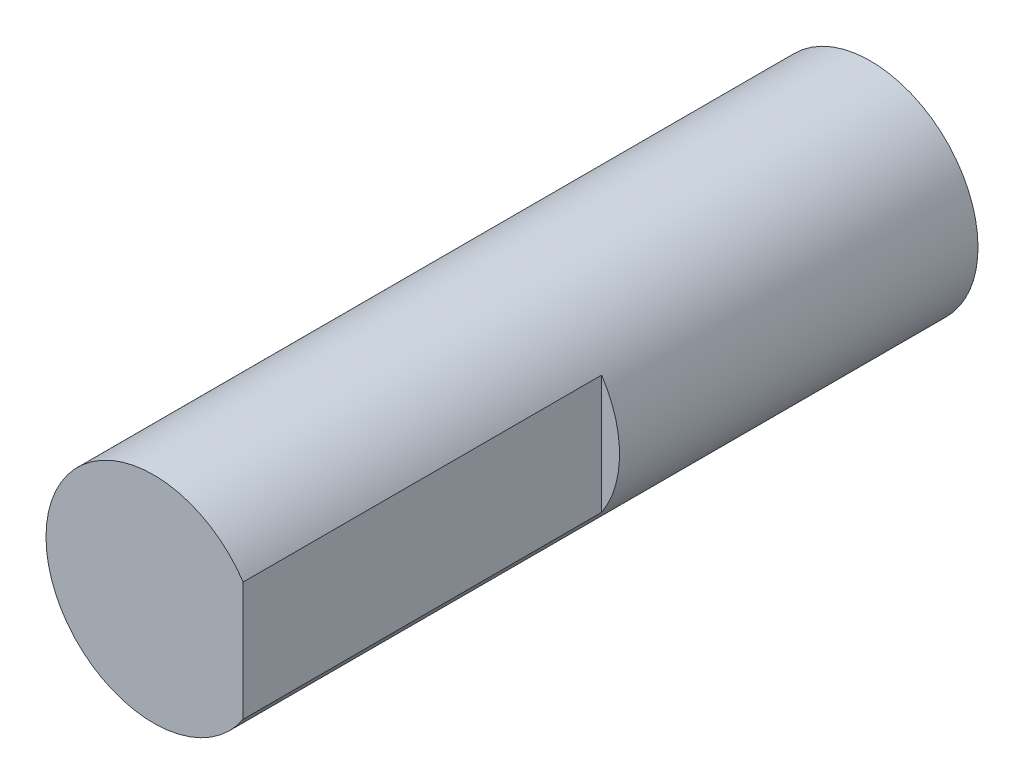
ISO-10303-21;
HEADER;
FILE_DESCRIPTION(('STEP AP214'),'2;1');
FILE_NAME('part.step','',(''),(''),'','','');
FILE_SCHEMA(('AUTOMOTIVE_DESIGN { 1 0 10303 214 1 1 1 1 }'));
ENDSEC;
DATA;
#1=APPLICATION_CONTEXT('core data for automotive mechanical design processes');
#2=APPLICATION_PROTOCOL_DEFINITION('international standard','automotive_design',2000,#1);
#3=PRODUCT_CONTEXT('',#1,'mechanical');
#4=PRODUCT('Part','Part','',(#3));
#5=PRODUCT_RELATED_PRODUCT_CATEGORY('part','',(#4));
#6=PRODUCT_DEFINITION_FORMATION('','',#4);
#7=PRODUCT_DEFINITION_CONTEXT('part definition',#1,'design');
#8=PRODUCT_DEFINITION('design','',#6,#7);
#9=PRODUCT_DEFINITION_SHAPE('','',#8);
#10=(LENGTH_UNIT() NAMED_UNIT(*) SI_UNIT(.MILLI.,.METRE.));
#11=(NAMED_UNIT(*) PLANE_ANGLE_UNIT() SI_UNIT($,.RADIAN.));
#12=(NAMED_UNIT(*) SI_UNIT($,.STERADIAN.) SOLID_ANGLE_UNIT());
#13=UNCERTAINTY_MEASURE_WITH_UNIT(LENGTH_MEASURE(1.E-05),#10,'distance_accuracy_value','');
#14=(GEOMETRIC_REPRESENTATION_CONTEXT(3) GLOBAL_UNCERTAINTY_ASSIGNED_CONTEXT((#13)) GLOBAL_UNIT_ASSIGNED_CONTEXT((#10,
#11,#12)) REPRESENTATION_CONTEXT('',''));
#15=CARTESIAN_POINT('',(0.,0.,0.));
#16=DIRECTION('',(0.,0.,1.));
#17=DIRECTION('',(1.,0.,0.));
#18=AXIS2_PLACEMENT_3D('',#15,#16,#17);
#19=CARTESIAN_POINT('',(0.,0.,20.));
#20=DIRECTION('',(0.,0.,-1.));
#21=DIRECTION('',(-1.,0.,0.));
#22=AXIS2_PLACEMENT_3D('',#19,#20,#21);
#23=CYLINDRICAL_SURFACE('',#22,3.);
#24=CARTESIAN_POINT('',(0.,0.,20.));
#25=DIRECTION('',(0.,0.,1.));
#26=DIRECTION('',(1.,0.,0.));
#27=AXIS2_PLACEMENT_3D('',#24,#25,#26);
#28=CIRCLE('',#27,3.);
#29=CARTESIAN_POINT('',(2.5,1.65831239517772,20.));
#30=VERTEX_POINT('',#29);
#31=CARTESIAN_POINT('',(2.49999999999997,-1.65831239517769,20.));
#32=VERTEX_POINT('',#31);
#33=EDGE_CURVE('E11',#30,#32,#28,.T.);
#34=ORIENTED_EDGE('',*,*,#33,.F.);
#35=DIRECTION('',(0.,0.,1.));
#36=VECTOR('',#35,1.);
#37=CARTESIAN_POINT('',(2.49999999999993,1.65831239517772,10.));
#38=LINE('',#37,#36);
#39=CARTESIAN_POINT('',(2.49999999999993,1.65831239517772,10.));
#40=VERTEX_POINT('',#39);
#41=EDGE_CURVE('E56',#40,#30,#38,.T.);
#42=ORIENTED_EDGE('',*,*,#41,.F.);
#43=CARTESIAN_POINT('',(0.,0.,10.));
#44=DIRECTION('',(0.,0.,1.));
#45=DIRECTION('',(1.,0.,0.));
#46=AXIS2_PLACEMENT_3D('',#43,#44,#45);
#47=CIRCLE('',#46,3.);
#48=CARTESIAN_POINT('',(2.49999999999991,-1.65831239517773,10.));
#49=VERTEX_POINT('',#48);
#50=EDGE_CURVE('E72',#49,#40,#47,.T.);
#51=ORIENTED_EDGE('',*,*,#50,.F.);
#52=DIRECTION('',(0.,0.,1.));
#53=VECTOR('',#52,1.);
#54=CARTESIAN_POINT('',(2.49999999999991,-1.65831239517773,10.));
#55=LINE('',#54,#53);
#56=EDGE_CURVE('E62',#49,#32,#55,.T.);
#57=ORIENTED_EDGE('',*,*,#56,.T.);
#58=EDGE_LOOP('',(#34,#42,#51,#57));
#59=FACE_BOUND('',#58,.T.);
#60=CARTESIAN_POINT('',(0.,0.,0.));
#61=DIRECTION('',(0.,0.,1.));
#62=DIRECTION('',(1.,0.,0.));
#63=AXIS2_PLACEMENT_3D('',#60,#61,#62);
#64=CIRCLE('',#63,3.);
#65=CARTESIAN_POINT('',(3.,0.,0.));
#66=VERTEX_POINT('',#65);
#67=EDGE_CURVE('E44',#66,#66,#64,.T.);
#68=ORIENTED_EDGE('',*,*,#67,.T.);
#69=EDGE_LOOP('',(#68));
#70=FACE_BOUND('',#69,.T.);
#71=ADVANCED_FACE('F41',(#59,#70),#23,.T.);
#72=CARTESIAN_POINT('',(0.,0.,20.));
#73=DIRECTION('',(0.,0.,1.));
#74=DIRECTION('',(1.,0.,0.));
#75=AXIS2_PLACEMENT_3D('',#72,#73,#74);
#76=PLANE('',#75);
#77=DIRECTION('',(0.,-1.,0.));
#78=VECTOR('',#77,1.);
#79=CARTESIAN_POINT('',(2.5,1.65831239517772,20.));
#80=LINE('',#79,#78);
#81=EDGE_CURVE('E67',#30,#32,#80,.T.);
#82=ORIENTED_EDGE('',*,*,#81,.F.);
#83=ORIENTED_EDGE('',*,*,#33,.T.);
#84=EDGE_LOOP('',(#82,#83));
#85=FACE_BOUND('',#84,.T.);
#86=ADVANCED_FACE('F79',(#85),#76,.T.);
#87=CARTESIAN_POINT('',(0.,0.,0.));
#88=DIRECTION('',(0.,0.,1.));
#89=DIRECTION('',(1.,0.,0.));
#90=AXIS2_PLACEMENT_3D('',#87,#88,#89);
#91=PLANE('',#90);
#92=ORIENTED_EDGE('',*,*,#67,.F.);
#93=EDGE_LOOP('',(#92));
#94=FACE_BOUND('',#93,.T.);
#95=ADVANCED_FACE('F81',(#94),#91,.F.);
#96=CARTESIAN_POINT('',(2.49999999999993,1.65831239517772,10.));
#97=DIRECTION('',(-1.,0.,0.));
#98=DIRECTION('',(0.,0.,1.));
#99=AXIS2_PLACEMENT_3D('',#96,#97,#98);
#100=PLANE('',#99);
#101=ORIENTED_EDGE('',*,*,#81,.T.);
#102=ORIENTED_EDGE('',*,*,#56,.F.);
#103=DIRECTION('',(0.,-1.,0.));
#104=VECTOR('',#103,1.);
#105=CARTESIAN_POINT('',(2.49999999999993,1.65831239517772,10.));
#106=LINE('',#105,#104);
#107=EDGE_CURVE('E96',#40,#49,#106,.T.);
#108=ORIENTED_EDGE('',*,*,#107,.F.);
#109=ORIENTED_EDGE('',*,*,#41,.T.);
#110=EDGE_LOOP('',(#101,#102,#108,#109));
#111=FACE_BOUND('',#110,.T.);
#112=ADVANCED_FACE('F68',(#111),#100,.F.);
#113=CARTESIAN_POINT('',(0.,0.,10.));
#114=DIRECTION('',(0.,0.,1.));
#115=DIRECTION('',(1.,0.,0.));
#116=AXIS2_PLACEMENT_3D('',#113,#114,#115);
#117=PLANE('',#116);
#118=ORIENTED_EDGE('',*,*,#50,.T.);
#119=ORIENTED_EDGE('',*,*,#107,.T.);
#120=EDGE_LOOP('',(#118,#119));
#121=FACE_BOUND('',#120,.T.);
#122=ADVANCED_FACE('F91',(#121),#117,.T.);
#123=CLOSED_SHELL('',(#71,#86,#95,#112,#122));
#124=MANIFOLD_SOLID_BREP('B2',#123);
#125=ADVANCED_BREP_SHAPE_REPRESENTATION('',(#18,#124),#14);
#126=SHAPE_DEFINITION_REPRESENTATION(#9,#125);
ENDSEC;
END-ISO-10303-21;
